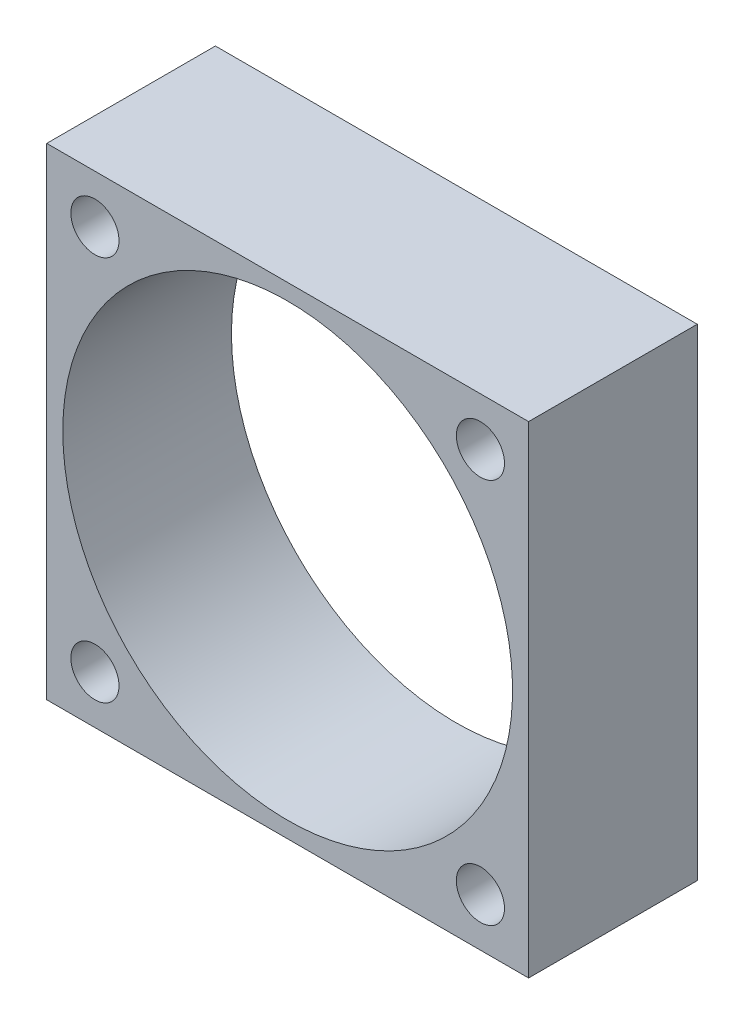
ISO-10303-21;
HEADER;
FILE_DESCRIPTION(('STEP AP214'),'2;1');
FILE_NAME('part.step','',(''),(''),'','','');
FILE_SCHEMA(('AUTOMOTIVE_DESIGN { 1 0 10303 214 1 1 1 1 }'));
ENDSEC;
DATA;
#1=APPLICATION_CONTEXT('core data for automotive mechanical design processes');
#2=APPLICATION_PROTOCOL_DEFINITION('international standard','automotive_design',2000,#1);
#3=PRODUCT_CONTEXT('',#1,'mechanical');
#4=PRODUCT('Part','Part','',(#3));
#5=PRODUCT_RELATED_PRODUCT_CATEGORY('part','',(#4));
#6=PRODUCT_DEFINITION_FORMATION('','',#4);
#7=PRODUCT_DEFINITION_CONTEXT('part definition',#1,'design');
#8=PRODUCT_DEFINITION('design','',#6,#7);
#9=PRODUCT_DEFINITION_SHAPE('','',#8);
#10=(LENGTH_UNIT() NAMED_UNIT(*) SI_UNIT(.MILLI.,.METRE.));
#11=(NAMED_UNIT(*) PLANE_ANGLE_UNIT() SI_UNIT($,.RADIAN.));
#12=(NAMED_UNIT(*) SI_UNIT($,.STERADIAN.) SOLID_ANGLE_UNIT());
#13=UNCERTAINTY_MEASURE_WITH_UNIT(LENGTH_MEASURE(1.E-05),#10,'distance_accuracy_value','');
#14=(GEOMETRIC_REPRESENTATION_CONTEXT(3) GLOBAL_UNCERTAINTY_ASSIGNED_CONTEXT((#13)) GLOBAL_UNIT_ASSIGNED_CONTEXT((#10,
#11,#12)) REPRESENTATION_CONTEXT('',''));
#15=CARTESIAN_POINT('',(0.,0.,0.));
#16=DIRECTION('',(0.,0.,1.));
#17=DIRECTION('',(1.,0.,0.));
#18=AXIS2_PLACEMENT_3D('',#15,#16,#17);
#19=CARTESIAN_POINT('',(0.,0.,10.5));
#20=DIRECTION('',(0.,0.,-1.));
#21=DIRECTION('',(-1.,0.,0.));
#22=AXIS2_PLACEMENT_3D('',#19,#20,#21);
#23=PLANE('',#22);
#24=DIRECTION('',(0.,1.,0.));
#25=VECTOR('',#24,1.);
#26=CARTESIAN_POINT('',(15.,-15.,10.5));
#27=LINE('',#26,#25);
#28=CARTESIAN_POINT('',(15.,-15.,10.5));
#29=VERTEX_POINT('',#28);
#30=CARTESIAN_POINT('',(15.,15.,10.5));
#31=VERTEX_POINT('',#30);
#32=EDGE_CURVE('E96',#29,#31,#27,.T.);
#33=ORIENTED_EDGE('',*,*,#32,.T.);
#34=DIRECTION('',(-1.,0.,0.));
#35=VECTOR('',#34,1.);
#36=CARTESIAN_POINT('',(-15.,15.,10.5));
#37=LINE('',#36,#35);
#38=CARTESIAN_POINT('',(-15.,15.,10.5));
#39=VERTEX_POINT('',#38);
#40=EDGE_CURVE('E91',#31,#39,#37,.T.);
#41=ORIENTED_EDGE('',*,*,#40,.T.);
#42=DIRECTION('',(0.,-1.,0.));
#43=VECTOR('',#42,1.);
#44=CARTESIAN_POINT('',(-15.,-15.,10.5));
#45=LINE('',#44,#43);
#46=CARTESIAN_POINT('',(-15.,-15.,10.5));
#47=VERTEX_POINT('',#46);
#48=EDGE_CURVE('E94',#39,#47,#45,.T.);
#49=ORIENTED_EDGE('',*,*,#48,.T.);
#50=DIRECTION('',(1.,0.,0.));
#51=VECTOR('',#50,1.);
#52=CARTESIAN_POINT('',(-15.,-15.,10.5));
#53=LINE('',#52,#51);
#54=EDGE_CURVE('E61',#47,#29,#53,.T.);
#55=ORIENTED_EDGE('',*,*,#54,.T.);
#56=EDGE_LOOP('',(#33,#41,#49,#55));
#57=FACE_BOUND('',#56,.T.);
#58=CARTESIAN_POINT('',(0.,0.,10.5));
#59=DIRECTION('',(0.,0.,1.));
#60=DIRECTION('',(1.,0.,0.));
#61=AXIS2_PLACEMENT_3D('',#58,#59,#60);
#62=CIRCLE('',#61,14.);
#63=CARTESIAN_POINT('',(-14.,0.,10.5));
#64=VERTEX_POINT('',#63);
#65=EDGE_CURVE('E116',#64,#64,#62,.T.);
#66=ORIENTED_EDGE('',*,*,#65,.F.);
#67=EDGE_LOOP('',(#66));
#68=FACE_BOUND('',#67,.T.);
#69=CARTESIAN_POINT('',(-12.,12.,10.5));
#70=DIRECTION('',(0.,0.,1.));
#71=DIRECTION('',(1.,0.,0.));
#72=AXIS2_PLACEMENT_3D('',#69,#70,#71);
#73=CIRCLE('',#72,1.5);
#74=CARTESIAN_POINT('',(-13.5,12.,10.5));
#75=VERTEX_POINT('',#74);
#76=EDGE_CURVE('E138',#75,#75,#73,.T.);
#77=ORIENTED_EDGE('',*,*,#76,.F.);
#78=EDGE_LOOP('',(#77));
#79=FACE_BOUND('',#78,.T.);
#80=CARTESIAN_POINT('',(12.,12.,10.5));
#81=DIRECTION('',(0.,0.,1.));
#82=DIRECTION('',(-1.,0.,0.));
#83=AXIS2_PLACEMENT_3D('',#80,#81,#82);
#84=CIRCLE('',#83,1.5);
#85=CARTESIAN_POINT('',(10.5,12.,10.5));
#86=VERTEX_POINT('',#85);
#87=EDGE_CURVE('E146',#86,#86,#84,.T.);
#88=ORIENTED_EDGE('',*,*,#87,.F.);
#89=EDGE_LOOP('',(#88));
#90=FACE_BOUND('',#89,.T.);
#91=CARTESIAN_POINT('',(12.,-12.,10.5));
#92=DIRECTION('',(0.,0.,1.));
#93=DIRECTION('',(1.,0.,0.));
#94=AXIS2_PLACEMENT_3D('',#91,#92,#93);
#95=CIRCLE('',#94,1.5);
#96=CARTESIAN_POINT('',(10.5,-12.,10.5));
#97=VERTEX_POINT('',#96);
#98=EDGE_CURVE('E154',#97,#97,#95,.T.);
#99=ORIENTED_EDGE('',*,*,#98,.F.);
#100=EDGE_LOOP('',(#99));
#101=FACE_BOUND('',#100,.T.);
#102=CARTESIAN_POINT('',(-12.,-12.,10.5));
#103=DIRECTION('',(0.,0.,1.));
#104=DIRECTION('',(-1.,0.,0.));
#105=AXIS2_PLACEMENT_3D('',#102,#103,#104);
#106=CIRCLE('',#105,1.5);
#107=CARTESIAN_POINT('',(-13.5,-12.,10.5));
#108=VERTEX_POINT('',#107);
#109=EDGE_CURVE('E162',#108,#108,#106,.T.);
#110=ORIENTED_EDGE('',*,*,#109,.F.);
#111=EDGE_LOOP('',(#110));
#112=FACE_BOUND('',#111,.T.);
#113=ADVANCED_FACE('F43',(#57,#68,#79,#90,#101,#112),#23,.F.);
#114=CARTESIAN_POINT('',(0.,0.,0.));
#115=DIRECTION('',(0.,0.,-1.));
#116=DIRECTION('',(-1.,0.,0.));
#117=AXIS2_PLACEMENT_3D('',#114,#115,#116);
#118=PLANE('',#117);
#119=CARTESIAN_POINT('',(12.,-12.,0.));
#120=DIRECTION('',(0.,0.,1.));
#121=DIRECTION('',(1.,0.,0.));
#122=AXIS2_PLACEMENT_3D('',#119,#120,#121);
#123=CIRCLE('',#122,1.5);
#124=CARTESIAN_POINT('',(10.5,-12.,0.));
#125=VERTEX_POINT('',#124);
#126=EDGE_CURVE('E158',#125,#125,#123,.T.);
#127=ORIENTED_EDGE('',*,*,#126,.T.);
#128=EDGE_LOOP('',(#127));
#129=FACE_BOUND('',#128,.T.);
#130=CARTESIAN_POINT('',(-12.,12.,0.));
#131=DIRECTION('',(0.,0.,1.));
#132=DIRECTION('',(1.,0.,0.));
#133=AXIS2_PLACEMENT_3D('',#130,#131,#132);
#134=CIRCLE('',#133,1.5);
#135=CARTESIAN_POINT('',(-13.5,12.,0.));
#136=VERTEX_POINT('',#135);
#137=EDGE_CURVE('E142',#136,#136,#134,.T.);
#138=ORIENTED_EDGE('',*,*,#137,.T.);
#139=EDGE_LOOP('',(#138));
#140=FACE_BOUND('',#139,.T.);
#141=DIRECTION('',(0.,1.,0.));
#142=VECTOR('',#141,1.);
#143=CARTESIAN_POINT('',(15.,-15.,0.));
#144=LINE('',#143,#142);
#145=CARTESIAN_POINT('',(15.,-15.,0.));
#146=VERTEX_POINT('',#145);
#147=CARTESIAN_POINT('',(15.,15.,0.));
#148=VERTEX_POINT('',#147);
#149=EDGE_CURVE('E112',#146,#148,#144,.T.);
#150=ORIENTED_EDGE('',*,*,#149,.F.);
#151=DIRECTION('',(1.,0.,0.));
#152=VECTOR('',#151,1.);
#153=CARTESIAN_POINT('',(-15.,-15.,0.));
#154=LINE('',#153,#152);
#155=CARTESIAN_POINT('',(-15.,-15.,0.));
#156=VERTEX_POINT('',#155);
#157=EDGE_CURVE('E84',#156,#146,#154,.T.);
#158=ORIENTED_EDGE('',*,*,#157,.F.);
#159=DIRECTION('',(0.,-1.,0.));
#160=VECTOR('',#159,1.);
#161=CARTESIAN_POINT('',(-15.,-15.,0.));
#162=LINE('',#161,#160);
#163=CARTESIAN_POINT('',(-15.,15.,0.));
#164=VERTEX_POINT('',#163);
#165=EDGE_CURVE('E78',#164,#156,#162,.T.);
#166=ORIENTED_EDGE('',*,*,#165,.F.);
#167=DIRECTION('',(-1.,0.,0.));
#168=VECTOR('',#167,1.);
#169=CARTESIAN_POINT('',(-15.,15.,0.));
#170=LINE('',#169,#168);
#171=EDGE_CURVE('E101',#148,#164,#170,.T.);
#172=ORIENTED_EDGE('',*,*,#171,.F.);
#173=EDGE_LOOP('',(#150,#158,#166,#172));
#174=FACE_BOUND('',#173,.T.);
#175=CARTESIAN_POINT('',(0.,0.,0.));
#176=DIRECTION('',(0.,0.,1.));
#177=DIRECTION('',(1.,0.,0.));
#178=AXIS2_PLACEMENT_3D('',#175,#176,#177);
#179=CIRCLE('',#178,14.);
#180=CARTESIAN_POINT('',(-14.,0.,0.));
#181=VERTEX_POINT('',#180);
#182=EDGE_CURVE('E134',#181,#181,#179,.T.);
#183=ORIENTED_EDGE('',*,*,#182,.T.);
#184=EDGE_LOOP('',(#183));
#185=FACE_BOUND('',#184,.T.);
#186=CARTESIAN_POINT('',(12.,12.,0.));
#187=DIRECTION('',(0.,0.,1.));
#188=DIRECTION('',(-1.,0.,0.));
#189=AXIS2_PLACEMENT_3D('',#186,#187,#188);
#190=CIRCLE('',#189,1.5);
#191=CARTESIAN_POINT('',(10.5,12.,0.));
#192=VERTEX_POINT('',#191);
#193=EDGE_CURVE('E150',#192,#192,#190,.T.);
#194=ORIENTED_EDGE('',*,*,#193,.T.);
#195=EDGE_LOOP('',(#194));
#196=FACE_BOUND('',#195,.T.);
#197=CARTESIAN_POINT('',(-12.,-12.,0.));
#198=DIRECTION('',(0.,0.,1.));
#199=DIRECTION('',(-1.,0.,0.));
#200=AXIS2_PLACEMENT_3D('',#197,#198,#199);
#201=CIRCLE('',#200,1.5);
#202=CARTESIAN_POINT('',(-13.5,-12.,0.));
#203=VERTEX_POINT('',#202);
#204=EDGE_CURVE('E166',#203,#203,#201,.T.);
#205=ORIENTED_EDGE('',*,*,#204,.T.);
#206=EDGE_LOOP('',(#205));
#207=FACE_BOUND('',#206,.T.);
#208=ADVANCED_FACE('F129',(#129,#140,#174,#185,#196,#207),#118,.T.);
#209=CARTESIAN_POINT('',(15.,-15.,10.5));
#210=DIRECTION('',(-1.,0.,0.));
#211=DIRECTION('',(0.,0.,1.));
#212=AXIS2_PLACEMENT_3D('',#209,#210,#211);
#213=PLANE('',#212);
#214=ORIENTED_EDGE('',*,*,#149,.T.);
#215=DIRECTION('',(0.,0.,-1.));
#216=VECTOR('',#215,1.);
#217=CARTESIAN_POINT('',(15.,15.,10.5));
#218=LINE('',#217,#216);
#219=EDGE_CURVE('E11',#31,#148,#218,.T.);
#220=ORIENTED_EDGE('',*,*,#219,.F.);
#221=ORIENTED_EDGE('',*,*,#32,.F.);
#222=DIRECTION('',(0.,0.,-1.));
#223=VECTOR('',#222,1.);
#224=CARTESIAN_POINT('',(15.,-15.,10.5));
#225=LINE('',#224,#223);
#226=EDGE_CURVE('E108',#29,#146,#225,.T.);
#227=ORIENTED_EDGE('',*,*,#226,.T.);
#228=EDGE_LOOP('',(#214,#220,#221,#227));
#229=FACE_BOUND('',#228,.T.);
#230=ADVANCED_FACE('F45',(#229),#213,.F.);
#231=CARTESIAN_POINT('',(-15.,15.,10.5));
#232=DIRECTION('',(0.,-1.,0.));
#233=DIRECTION('',(0.,0.,-1.));
#234=AXIS2_PLACEMENT_3D('',#231,#232,#233);
#235=PLANE('',#234);
#236=ORIENTED_EDGE('',*,*,#171,.T.);
#237=DIRECTION('',(0.,0.,-1.));
#238=VECTOR('',#237,1.);
#239=CARTESIAN_POINT('',(-15.,15.,10.5));
#240=LINE('',#239,#238);
#241=EDGE_CURVE('E53',#39,#164,#240,.T.);
#242=ORIENTED_EDGE('',*,*,#241,.F.);
#243=ORIENTED_EDGE('',*,*,#40,.F.);
#244=ORIENTED_EDGE('',*,*,#219,.T.);
#245=EDGE_LOOP('',(#236,#242,#243,#244));
#246=FACE_BOUND('',#245,.T.);
#247=ADVANCED_FACE('F100',(#246),#235,.F.);
#248=CARTESIAN_POINT('',(-15.,-15.,10.5));
#249=DIRECTION('',(1.,0.,0.));
#250=DIRECTION('',(0.,0.,-1.));
#251=AXIS2_PLACEMENT_3D('',#248,#249,#250);
#252=PLANE('',#251);
#253=ORIENTED_EDGE('',*,*,#165,.T.);
#254=DIRECTION('',(0.,0.,-1.));
#255=VECTOR('',#254,1.);
#256=CARTESIAN_POINT('',(-15.,-15.,10.5));
#257=LINE('',#256,#255);
#258=EDGE_CURVE('E103',#47,#156,#257,.T.);
#259=ORIENTED_EDGE('',*,*,#258,.F.);
#260=ORIENTED_EDGE('',*,*,#48,.F.);
#261=ORIENTED_EDGE('',*,*,#241,.T.);
#262=EDGE_LOOP('',(#253,#259,#260,#261));
#263=FACE_BOUND('',#262,.T.);
#264=ADVANCED_FACE('F104',(#263),#252,.F.);
#265=CARTESIAN_POINT('',(-15.,-15.,10.5));
#266=DIRECTION('',(0.,1.,0.));
#267=DIRECTION('',(0.,0.,1.));
#268=AXIS2_PLACEMENT_3D('',#265,#266,#267);
#269=PLANE('',#268);
#270=ORIENTED_EDGE('',*,*,#157,.T.);
#271=ORIENTED_EDGE('',*,*,#226,.F.);
#272=ORIENTED_EDGE('',*,*,#54,.F.);
#273=ORIENTED_EDGE('',*,*,#258,.T.);
#274=EDGE_LOOP('',(#270,#271,#272,#273));
#275=FACE_BOUND('',#274,.T.);
#276=ADVANCED_FACE('F126',(#275),#269,.F.);
#277=CARTESIAN_POINT('',(0.,0.,10.5));
#278=DIRECTION('',(0.,0.,-1.));
#279=DIRECTION('',(-1.,0.,0.));
#280=AXIS2_PLACEMENT_3D('',#277,#278,#279);
#281=CYLINDRICAL_SURFACE('',#280,14.);
#282=CARTESIAN_POINT('',(-14.,0.,10.5));
#283=CARTESIAN_POINT('',(-14.,0.,10.390625));
#284=CARTESIAN_POINT('',(-14.,0.,10.28125));
#285=CARTESIAN_POINT('',(-14.,0.,10.0625));
#286=CARTESIAN_POINT('',(-14.,0.,9.953125));
#287=CARTESIAN_POINT('',(-14.,0.,9.734375));
#288=CARTESIAN_POINT('',(-14.,0.,9.625));
#289=CARTESIAN_POINT('',(-14.,0.,9.40625));
#290=CARTESIAN_POINT('',(-14.,0.,9.296875));
#291=CARTESIAN_POINT('',(-14.,0.,9.078125));
#292=CARTESIAN_POINT('',(-14.,0.,8.96875));
#293=CARTESIAN_POINT('',(-14.,0.,8.75));
#294=CARTESIAN_POINT('',(-14.,0.,8.640625));
#295=CARTESIAN_POINT('',(-14.,0.,8.421875));
#296=CARTESIAN_POINT('',(-14.,0.,8.3125));
#297=CARTESIAN_POINT('',(-14.,0.,8.09375));
#298=CARTESIAN_POINT('',(-14.,0.,7.984375));
#299=CARTESIAN_POINT('',(-14.,0.,7.765625));
#300=CARTESIAN_POINT('',(-14.,0.,7.65625));
#301=CARTESIAN_POINT('',(-14.,0.,7.4375));
#302=CARTESIAN_POINT('',(-14.,0.,7.328125));
#303=CARTESIAN_POINT('',(-14.,0.,7.109375));
#304=CARTESIAN_POINT('',(-14.,0.,7.));
#305=CARTESIAN_POINT('',(-14.,0.,6.78125));
#306=CARTESIAN_POINT('',(-14.,0.,6.671875));
#307=CARTESIAN_POINT('',(-14.,0.,6.453125));
#308=CARTESIAN_POINT('',(-14.,0.,6.34375));
#309=CARTESIAN_POINT('',(-14.,0.,6.125));
#310=CARTESIAN_POINT('',(-14.,0.,6.015625));
#311=CARTESIAN_POINT('',(-14.,0.,5.796875));
#312=CARTESIAN_POINT('',(-14.,0.,5.6875));
#313=CARTESIAN_POINT('',(-14.,0.,5.46875));
#314=CARTESIAN_POINT('',(-14.,0.,5.359375));
#315=CARTESIAN_POINT('',(-14.,0.,5.140625));
#316=CARTESIAN_POINT('',(-14.,0.,5.03125));
#317=CARTESIAN_POINT('',(-14.,0.,4.8125));
#318=CARTESIAN_POINT('',(-14.,0.,4.703125));
#319=CARTESIAN_POINT('',(-14.,0.,4.484375));
#320=CARTESIAN_POINT('',(-14.,0.,4.375));
#321=CARTESIAN_POINT('',(-14.,0.,4.15625));
#322=CARTESIAN_POINT('',(-14.,0.,4.046875));
#323=CARTESIAN_POINT('',(-14.,0.,3.828125));
#324=CARTESIAN_POINT('',(-14.,0.,3.71875));
#325=CARTESIAN_POINT('',(-14.,0.,3.5));
#326=CARTESIAN_POINT('',(-14.,0.,3.390625));
#327=CARTESIAN_POINT('',(-14.,0.,3.171875));
#328=CARTESIAN_POINT('',(-14.,0.,3.0625));
#329=CARTESIAN_POINT('',(-14.,0.,2.84375));
#330=CARTESIAN_POINT('',(-14.,0.,2.734375));
#331=CARTESIAN_POINT('',(-14.,0.,2.515625));
#332=CARTESIAN_POINT('',(-14.,0.,2.40625));
#333=CARTESIAN_POINT('',(-14.,0.,2.1875));
#334=CARTESIAN_POINT('',(-14.,0.,2.078125));
#335=CARTESIAN_POINT('',(-14.,0.,1.859375));
#336=CARTESIAN_POINT('',(-14.,0.,1.75));
#337=CARTESIAN_POINT('',(-14.,0.,1.53125));
#338=CARTESIAN_POINT('',(-14.,0.,1.421875));
#339=CARTESIAN_POINT('',(-14.,0.,1.203125));
#340=CARTESIAN_POINT('',(-14.,0.,1.09375));
#341=CARTESIAN_POINT('',(-14.,0.,0.875000000000001));
#342=CARTESIAN_POINT('',(-14.,0.,0.765625000000001));
#343=CARTESIAN_POINT('',(-14.,0.,0.546875));
#344=CARTESIAN_POINT('',(-14.,0.,0.4375));
#345=CARTESIAN_POINT('',(-14.,0.,0.21875));
#346=CARTESIAN_POINT('',(-14.,0.,0.109375));
#347=CARTESIAN_POINT('',(-14.,0.,0.));
#348=B_SPLINE_CURVE_WITH_KNOTS('',3,(#282,#283,#284,#285,#286,#287,#288,#289,#290,#291,#292,
#293,#294,#295,#296,#297,#298,#299,#300,#301,#302,#303,#304,#305,#306,#307,#308,#309,#310,#311,
#312,#313,#314,#315,#316,#317,#318,#319,#320,#321,#322,#323,#324,#325,#326,#327,#328,#329,#330,
#331,#332,#333,#334,#335,#336,#337,#338,#339,#340,#341,#342,#343,#344,#345,#346,#347),
.UNSPECIFIED.,.F.,.F.,(4,2,2,2,2,2,2,2,2,2,2,2,2,2,2,2,2,2,2,2,2,2,2,2,2,2,2,2,2,2,2,2,4),(0.,
0.328125,0.656250000000001,0.984375000000001,1.3125,1.640625,1.96875,2.296875,2.625,2.953125,
3.28125,3.609375,3.9375,4.265625,4.59375,4.921875,5.25,5.578125,5.90625,6.234375,6.5625,
6.890625,7.21875,7.546875,7.875,8.203125,8.53125,8.859375,9.1875,9.515625,9.84375,10.171875,
10.5),.UNSPECIFIED.);
#349=EDGE_CURVE('BSEAM185',#64,#181,#348,.T.);
#350=ORIENTED_EDGE('',*,*,#65,.T.);
#351=ORIENTED_EDGE('',*,*,#182,.F.);
#352=ORIENTED_EDGE('',*,*,#349,.T.);
#353=ORIENTED_EDGE('',*,*,#349,.F.);
#354=EDGE_LOOP('',(#350,#352,#351,#353));
#355=FACE_BOUND('',#354,.T.);
#356=ADVANCED_FACE('F185',(#355),#281,.F.);
#357=CARTESIAN_POINT('',(-12.,12.,10.5));
#358=DIRECTION('',(0.,0.,-1.));
#359=DIRECTION('',(-1.,0.,0.));
#360=AXIS2_PLACEMENT_3D('',#357,#358,#359);
#361=CYLINDRICAL_SURFACE('',#360,1.5);
#362=CARTESIAN_POINT('',(-13.5,12.,10.5));
#363=CARTESIAN_POINT('',(-13.5,12.,10.390625));
#364=CARTESIAN_POINT('',(-13.5,12.,10.28125));
#365=CARTESIAN_POINT('',(-13.5,12.,10.0625));
#366=CARTESIAN_POINT('',(-13.5,12.,9.953125));
#367=CARTESIAN_POINT('',(-13.5,12.,9.734375));
#368=CARTESIAN_POINT('',(-13.5,12.,9.625));
#369=CARTESIAN_POINT('',(-13.5,12.,9.40625));
#370=CARTESIAN_POINT('',(-13.5,12.,9.296875));
#371=CARTESIAN_POINT('',(-13.5,12.,9.078125));
#372=CARTESIAN_POINT('',(-13.5,12.,8.96875));
#373=CARTESIAN_POINT('',(-13.5,12.,8.75));
#374=CARTESIAN_POINT('',(-13.5,12.,8.640625));
#375=CARTESIAN_POINT('',(-13.5,12.,8.421875));
#376=CARTESIAN_POINT('',(-13.5,12.,8.3125));
#377=CARTESIAN_POINT('',(-13.5,12.,8.09375));
#378=CARTESIAN_POINT('',(-13.5,12.,7.984375));
#379=CARTESIAN_POINT('',(-13.5,12.,7.765625));
#380=CARTESIAN_POINT('',(-13.5,12.,7.65625));
#381=CARTESIAN_POINT('',(-13.5,12.,7.4375));
#382=CARTESIAN_POINT('',(-13.5,12.,7.328125));
#383=CARTESIAN_POINT('',(-13.5,12.,7.109375));
#384=CARTESIAN_POINT('',(-13.5,12.,7.));
#385=CARTESIAN_POINT('',(-13.5,12.,6.78125));
#386=CARTESIAN_POINT('',(-13.5,12.,6.671875));
#387=CARTESIAN_POINT('',(-13.5,12.,6.453125));
#388=CARTESIAN_POINT('',(-13.5,12.,6.34375));
#389=CARTESIAN_POINT('',(-13.5,12.,6.125));
#390=CARTESIAN_POINT('',(-13.5,12.,6.015625));
#391=CARTESIAN_POINT('',(-13.5,12.,5.796875));
#392=CARTESIAN_POINT('',(-13.5,12.,5.6875));
#393=CARTESIAN_POINT('',(-13.5,12.,5.46875));
#394=CARTESIAN_POINT('',(-13.5,12.,5.359375));
#395=CARTESIAN_POINT('',(-13.5,12.,5.140625));
#396=CARTESIAN_POINT('',(-13.5,12.,5.03125));
#397=CARTESIAN_POINT('',(-13.5,12.,4.8125));
#398=CARTESIAN_POINT('',(-13.5,12.,4.703125));
#399=CARTESIAN_POINT('',(-13.5,12.,4.484375));
#400=CARTESIAN_POINT('',(-13.5,12.,4.375));
#401=CARTESIAN_POINT('',(-13.5,12.,4.15625));
#402=CARTESIAN_POINT('',(-13.5,12.,4.046875));
#403=CARTESIAN_POINT('',(-13.5,12.,3.828125));
#404=CARTESIAN_POINT('',(-13.5,12.,3.71875));
#405=CARTESIAN_POINT('',(-13.5,12.,3.5));
#406=CARTESIAN_POINT('',(-13.5,12.,3.390625));
#407=CARTESIAN_POINT('',(-13.5,12.,3.171875));
#408=CARTESIAN_POINT('',(-13.5,12.,3.0625));
#409=CARTESIAN_POINT('',(-13.5,12.,2.84375));
#410=CARTESIAN_POINT('',(-13.5,12.,2.734375));
#411=CARTESIAN_POINT('',(-13.5,12.,2.515625));
#412=CARTESIAN_POINT('',(-13.5,12.,2.40625));
#413=CARTESIAN_POINT('',(-13.5,12.,2.1875));
#414=CARTESIAN_POINT('',(-13.5,12.,2.078125));
#415=CARTESIAN_POINT('',(-13.5,12.,1.859375));
#416=CARTESIAN_POINT('',(-13.5,12.,1.75));
#417=CARTESIAN_POINT('',(-13.5,12.,1.53125));
#418=CARTESIAN_POINT('',(-13.5,12.,1.421875));
#419=CARTESIAN_POINT('',(-13.5,12.,1.203125));
#420=CARTESIAN_POINT('',(-13.5,12.,1.09375));
#421=CARTESIAN_POINT('',(-13.5,12.,0.875000000000001));
#422=CARTESIAN_POINT('',(-13.5,12.,0.765625000000001));
#423=CARTESIAN_POINT('',(-13.5,12.,0.546875));
#424=CARTESIAN_POINT('',(-13.5,12.,0.4375));
#425=CARTESIAN_POINT('',(-13.5,12.,0.21875));
#426=CARTESIAN_POINT('',(-13.5,12.,0.109375));
#427=CARTESIAN_POINT('',(-13.5,12.,0.));
#428=B_SPLINE_CURVE_WITH_KNOTS('',3,(#362,#363,#364,#365,#366,#367,#368,#369,#370,#371,#372,
#373,#374,#375,#376,#377,#378,#379,#380,#381,#382,#383,#384,#385,#386,#387,#388,#389,#390,#391,
#392,#393,#394,#395,#396,#397,#398,#399,#400,#401,#402,#403,#404,#405,#406,#407,#408,#409,#410,
#411,#412,#413,#414,#415,#416,#417,#418,#419,#420,#421,#422,#423,#424,#425,#426,#427),
.UNSPECIFIED.,.F.,.F.,(4,2,2,2,2,2,2,2,2,2,2,2,2,2,2,2,2,2,2,2,2,2,2,2,2,2,2,2,2,2,2,2,4),(0.,
0.328124999999999,0.656249999999999,0.984374999999999,1.3125,1.640625,1.96875,2.296875,2.625,
2.953125,3.28125,3.609375,3.9375,4.265625,4.59375,4.921875,5.25,5.578125,5.90625,6.234375,
6.5625,6.890625,7.21875,7.546875,7.875,8.203125,8.53125,8.859375,9.1875,9.515625,9.84375,
10.171875,10.5),.UNSPECIFIED.);
#429=EDGE_CURVE('BSEAM239',#75,#136,#428,.T.);
#430=ORIENTED_EDGE('',*,*,#76,.T.);
#431=ORIENTED_EDGE('',*,*,#137,.F.);
#432=ORIENTED_EDGE('',*,*,#429,.T.);
#433=ORIENTED_EDGE('',*,*,#429,.F.);
#434=EDGE_LOOP('',(#430,#432,#431,#433));
#435=FACE_BOUND('',#434,.T.);
#436=ADVANCED_FACE('F239',(#435),#361,.F.);
#437=CARTESIAN_POINT('',(12.,12.,10.5));
#438=DIRECTION('',(0.,0.,-1.));
#439=DIRECTION('',(-1.,0.,0.));
#440=AXIS2_PLACEMENT_3D('',#437,#438,#439);
#441=CYLINDRICAL_SURFACE('',#440,1.5);
#442=CARTESIAN_POINT('',(10.5,12.,10.5));
#443=CARTESIAN_POINT('',(10.5,12.,10.390625));
#444=CARTESIAN_POINT('',(10.5,12.,10.28125));
#445=CARTESIAN_POINT('',(10.5,12.,10.0625));
#446=CARTESIAN_POINT('',(10.5,12.,9.953125));
#447=CARTESIAN_POINT('',(10.5,12.,9.734375));
#448=CARTESIAN_POINT('',(10.5,12.,9.625));
#449=CARTESIAN_POINT('',(10.5,12.,9.40625));
#450=CARTESIAN_POINT('',(10.5,12.,9.296875));
#451=CARTESIAN_POINT('',(10.5,12.,9.078125));
#452=CARTESIAN_POINT('',(10.5,12.,8.96875));
#453=CARTESIAN_POINT('',(10.5,12.,8.75));
#454=CARTESIAN_POINT('',(10.5,12.,8.640625));
#455=CARTESIAN_POINT('',(10.5,12.,8.421875));
#456=CARTESIAN_POINT('',(10.5,12.,8.3125));
#457=CARTESIAN_POINT('',(10.5,12.,8.09375));
#458=CARTESIAN_POINT('',(10.5,12.,7.984375));
#459=CARTESIAN_POINT('',(10.5,12.,7.765625));
#460=CARTESIAN_POINT('',(10.5,12.,7.65625));
#461=CARTESIAN_POINT('',(10.5,12.,7.4375));
#462=CARTESIAN_POINT('',(10.5,12.,7.328125));
#463=CARTESIAN_POINT('',(10.5,12.,7.109375));
#464=CARTESIAN_POINT('',(10.5,12.,7.));
#465=CARTESIAN_POINT('',(10.5,12.,6.78125));
#466=CARTESIAN_POINT('',(10.5,12.,6.671875));
#467=CARTESIAN_POINT('',(10.5,12.,6.453125));
#468=CARTESIAN_POINT('',(10.5,12.,6.34375));
#469=CARTESIAN_POINT('',(10.5,12.,6.125));
#470=CARTESIAN_POINT('',(10.5,12.,6.015625));
#471=CARTESIAN_POINT('',(10.5,12.,5.796875));
#472=CARTESIAN_POINT('',(10.5,12.,5.6875));
#473=CARTESIAN_POINT('',(10.5,12.,5.46875));
#474=CARTESIAN_POINT('',(10.5,12.,5.359375));
#475=CARTESIAN_POINT('',(10.5,12.,5.140625));
#476=CARTESIAN_POINT('',(10.5,12.,5.03125));
#477=CARTESIAN_POINT('',(10.5,12.,4.8125));
#478=CARTESIAN_POINT('',(10.5,12.,4.703125));
#479=CARTESIAN_POINT('',(10.5,12.,4.484375));
#480=CARTESIAN_POINT('',(10.5,12.,4.375));
#481=CARTESIAN_POINT('',(10.5,12.,4.15625));
#482=CARTESIAN_POINT('',(10.5,12.,4.046875));
#483=CARTESIAN_POINT('',(10.5,12.,3.828125));
#484=CARTESIAN_POINT('',(10.5,12.,3.71875));
#485=CARTESIAN_POINT('',(10.5,12.,3.5));
#486=CARTESIAN_POINT('',(10.5,12.,3.390625));
#487=CARTESIAN_POINT('',(10.5,12.,3.171875));
#488=CARTESIAN_POINT('',(10.5,12.,3.0625));
#489=CARTESIAN_POINT('',(10.5,12.,2.84375));
#490=CARTESIAN_POINT('',(10.5,12.,2.734375));
#491=CARTESIAN_POINT('',(10.5,12.,2.515625));
#492=CARTESIAN_POINT('',(10.5,12.,2.40625));
#493=CARTESIAN_POINT('',(10.5,12.,2.1875));
#494=CARTESIAN_POINT('',(10.5,12.,2.078125));
#495=CARTESIAN_POINT('',(10.5,12.,1.859375));
#496=CARTESIAN_POINT('',(10.5,12.,1.75));
#497=CARTESIAN_POINT('',(10.5,12.,1.53125));
#498=CARTESIAN_POINT('',(10.5,12.,1.421875));
#499=CARTESIAN_POINT('',(10.5,12.,1.203125));
#500=CARTESIAN_POINT('',(10.5,12.,1.09375));
#501=CARTESIAN_POINT('',(10.5,12.,0.875000000000001));
#502=CARTESIAN_POINT('',(10.5,12.,0.765625000000001));
#503=CARTESIAN_POINT('',(10.5,12.,0.546875));
#504=CARTESIAN_POINT('',(10.5,12.,0.4375));
#505=CARTESIAN_POINT('',(10.5,12.,0.21875));
#506=CARTESIAN_POINT('',(10.5,12.,0.109375));
#507=CARTESIAN_POINT('',(10.5,12.,0.));
#508=B_SPLINE_CURVE_WITH_KNOTS('',3,(#442,#443,#444,#445,#446,#447,#448,#449,#450,#451,#452,
#453,#454,#455,#456,#457,#458,#459,#460,#461,#462,#463,#464,#465,#466,#467,#468,#469,#470,#471,
#472,#473,#474,#475,#476,#477,#478,#479,#480,#481,#482,#483,#484,#485,#486,#487,#488,#489,#490,
#491,#492,#493,#494,#495,#496,#497,#498,#499,#500,#501,#502,#503,#504,#505,#506,#507),
.UNSPECIFIED.,.F.,.F.,(4,2,2,2,2,2,2,2,2,2,2,2,2,2,2,2,2,2,2,2,2,2,2,2,2,2,2,2,2,2,2,2,4),(0.,
0.328124999999999,0.656249999999999,0.984374999999999,1.3125,1.640625,1.96875,2.296875,2.625,
2.953125,3.28125,3.609375,3.9375,4.265625,4.59375,4.921875,5.25,5.578125,5.90625,6.234375,
6.5625,6.890625,7.21875,7.546875,7.875,8.203125,8.53125,8.859375,9.1875,9.515625,9.84375,
10.171875,10.5),.UNSPECIFIED.);
#509=EDGE_CURVE('BSEAM248',#86,#192,#508,.T.);
#510=ORIENTED_EDGE('',*,*,#87,.T.);
#511=ORIENTED_EDGE('',*,*,#193,.F.);
#512=ORIENTED_EDGE('',*,*,#509,.T.);
#513=ORIENTED_EDGE('',*,*,#509,.F.);
#514=EDGE_LOOP('',(#510,#512,#511,#513));
#515=FACE_BOUND('',#514,.T.);
#516=ADVANCED_FACE('F248',(#515),#441,.F.);
#517=CARTESIAN_POINT('',(12.,-12.,10.5));
#518=DIRECTION('',(0.,0.,-1.));
#519=DIRECTION('',(-1.,0.,0.));
#520=AXIS2_PLACEMENT_3D('',#517,#518,#519);
#521=CYLINDRICAL_SURFACE('',#520,1.5);
#522=CARTESIAN_POINT('',(10.5,-12.,10.5));
#523=CARTESIAN_POINT('',(10.5,-12.,10.390625));
#524=CARTESIAN_POINT('',(10.5,-12.,10.28125));
#525=CARTESIAN_POINT('',(10.5,-12.,10.0625));
#526=CARTESIAN_POINT('',(10.5,-12.,9.953125));
#527=CARTESIAN_POINT('',(10.5,-12.,9.734375));
#528=CARTESIAN_POINT('',(10.5,-12.,9.625));
#529=CARTESIAN_POINT('',(10.5,-12.,9.40625));
#530=CARTESIAN_POINT('',(10.5,-12.,9.296875));
#531=CARTESIAN_POINT('',(10.5,-12.,9.078125));
#532=CARTESIAN_POINT('',(10.5,-12.,8.96875));
#533=CARTESIAN_POINT('',(10.5,-12.,8.75));
#534=CARTESIAN_POINT('',(10.5,-12.,8.640625));
#535=CARTESIAN_POINT('',(10.5,-12.,8.421875));
#536=CARTESIAN_POINT('',(10.5,-12.,8.3125));
#537=CARTESIAN_POINT('',(10.5,-12.,8.09375));
#538=CARTESIAN_POINT('',(10.5,-12.,7.984375));
#539=CARTESIAN_POINT('',(10.5,-12.,7.765625));
#540=CARTESIAN_POINT('',(10.5,-12.,7.65625));
#541=CARTESIAN_POINT('',(10.5,-12.,7.4375));
#542=CARTESIAN_POINT('',(10.5,-12.,7.328125));
#543=CARTESIAN_POINT('',(10.5,-12.,7.109375));
#544=CARTESIAN_POINT('',(10.5,-12.,7.));
#545=CARTESIAN_POINT('',(10.5,-12.,6.78125));
#546=CARTESIAN_POINT('',(10.5,-12.,6.671875));
#547=CARTESIAN_POINT('',(10.5,-12.,6.453125));
#548=CARTESIAN_POINT('',(10.5,-12.,6.34375));
#549=CARTESIAN_POINT('',(10.5,-12.,6.125));
#550=CARTESIAN_POINT('',(10.5,-12.,6.015625));
#551=CARTESIAN_POINT('',(10.5,-12.,5.796875));
#552=CARTESIAN_POINT('',(10.5,-12.,5.6875));
#553=CARTESIAN_POINT('',(10.5,-12.,5.46875));
#554=CARTESIAN_POINT('',(10.5,-12.,5.359375));
#555=CARTESIAN_POINT('',(10.5,-12.,5.140625));
#556=CARTESIAN_POINT('',(10.5,-12.,5.03125));
#557=CARTESIAN_POINT('',(10.5,-12.,4.8125));
#558=CARTESIAN_POINT('',(10.5,-12.,4.703125));
#559=CARTESIAN_POINT('',(10.5,-12.,4.484375));
#560=CARTESIAN_POINT('',(10.5,-12.,4.375));
#561=CARTESIAN_POINT('',(10.5,-12.,4.15625));
#562=CARTESIAN_POINT('',(10.5,-12.,4.046875));
#563=CARTESIAN_POINT('',(10.5,-12.,3.828125));
#564=CARTESIAN_POINT('',(10.5,-12.,3.71875));
#565=CARTESIAN_POINT('',(10.5,-12.,3.5));
#566=CARTESIAN_POINT('',(10.5,-12.,3.390625));
#567=CARTESIAN_POINT('',(10.5,-12.,3.171875));
#568=CARTESIAN_POINT('',(10.5,-12.,3.0625));
#569=CARTESIAN_POINT('',(10.5,-12.,2.84375));
#570=CARTESIAN_POINT('',(10.5,-12.,2.734375));
#571=CARTESIAN_POINT('',(10.5,-12.,2.515625));
#572=CARTESIAN_POINT('',(10.5,-12.,2.40625));
#573=CARTESIAN_POINT('',(10.5,-12.,2.1875));
#574=CARTESIAN_POINT('',(10.5,-12.,2.078125));
#575=CARTESIAN_POINT('',(10.5,-12.,1.859375));
#576=CARTESIAN_POINT('',(10.5,-12.,1.75));
#577=CARTESIAN_POINT('',(10.5,-12.,1.53125));
#578=CARTESIAN_POINT('',(10.5,-12.,1.421875));
#579=CARTESIAN_POINT('',(10.5,-12.,1.203125));
#580=CARTESIAN_POINT('',(10.5,-12.,1.09375));
#581=CARTESIAN_POINT('',(10.5,-12.,0.875000000000001));
#582=CARTESIAN_POINT('',(10.5,-12.,0.765625000000001));
#583=CARTESIAN_POINT('',(10.5,-12.,0.546875));
#584=CARTESIAN_POINT('',(10.5,-12.,0.4375));
#585=CARTESIAN_POINT('',(10.5,-12.,0.21875));
#586=CARTESIAN_POINT('',(10.5,-12.,0.109375));
#587=CARTESIAN_POINT('',(10.5,-12.,0.));
#588=B_SPLINE_CURVE_WITH_KNOTS('',3,(#522,#523,#524,#525,#526,#527,#528,#529,#530,#531,#532,
#533,#534,#535,#536,#537,#538,#539,#540,#541,#542,#543,#544,#545,#546,#547,#548,#549,#550,#551,
#552,#553,#554,#555,#556,#557,#558,#559,#560,#561,#562,#563,#564,#565,#566,#567,#568,#569,#570,
#571,#572,#573,#574,#575,#576,#577,#578,#579,#580,#581,#582,#583,#584,#585,#586,#587),
.UNSPECIFIED.,.F.,.F.,(4,2,2,2,2,2,2,2,2,2,2,2,2,2,2,2,2,2,2,2,2,2,2,2,2,2,2,2,2,2,2,2,4),(0.,
0.328124999999999,0.656249999999999,0.984374999999999,1.3125,1.640625,1.96875,2.296875,2.625,
2.953125,3.28125,3.609375,3.9375,4.265625,4.59375,4.921875,5.25,5.578125,5.90625,6.234375,
6.5625,6.890625,7.21875,7.546875,7.875,8.203125,8.53125,8.859375,9.1875,9.515625,9.84375,
10.171875,10.5),.UNSPECIFIED.);
#589=EDGE_CURVE('BSEAM257',#97,#125,#588,.T.);
#590=ORIENTED_EDGE('',*,*,#98,.T.);
#591=ORIENTED_EDGE('',*,*,#126,.F.);
#592=ORIENTED_EDGE('',*,*,#589,.T.);
#593=ORIENTED_EDGE('',*,*,#589,.F.);
#594=EDGE_LOOP('',(#590,#592,#591,#593));
#595=FACE_BOUND('',#594,.T.);
#596=ADVANCED_FACE('F257',(#595),#521,.F.);
#597=CARTESIAN_POINT('',(-12.,-12.,10.5));
#598=DIRECTION('',(0.,0.,-1.));
#599=DIRECTION('',(-1.,0.,0.));
#600=AXIS2_PLACEMENT_3D('',#597,#598,#599);
#601=CYLINDRICAL_SURFACE('',#600,1.5);
#602=CARTESIAN_POINT('',(-13.5,-12.,10.5));
#603=CARTESIAN_POINT('',(-13.5,-12.,10.390625));
#604=CARTESIAN_POINT('',(-13.5,-12.,10.28125));
#605=CARTESIAN_POINT('',(-13.5,-12.,10.0625));
#606=CARTESIAN_POINT('',(-13.5,-12.,9.953125));
#607=CARTESIAN_POINT('',(-13.5,-12.,9.734375));
#608=CARTESIAN_POINT('',(-13.5,-12.,9.625));
#609=CARTESIAN_POINT('',(-13.5,-12.,9.40625));
#610=CARTESIAN_POINT('',(-13.5,-12.,9.296875));
#611=CARTESIAN_POINT('',(-13.5,-12.,9.078125));
#612=CARTESIAN_POINT('',(-13.5,-12.,8.96875));
#613=CARTESIAN_POINT('',(-13.5,-12.,8.75));
#614=CARTESIAN_POINT('',(-13.5,-12.,8.640625));
#615=CARTESIAN_POINT('',(-13.5,-12.,8.421875));
#616=CARTESIAN_POINT('',(-13.5,-12.,8.3125));
#617=CARTESIAN_POINT('',(-13.5,-12.,8.09375));
#618=CARTESIAN_POINT('',(-13.5,-12.,7.984375));
#619=CARTESIAN_POINT('',(-13.5,-12.,7.765625));
#620=CARTESIAN_POINT('',(-13.5,-12.,7.65625));
#621=CARTESIAN_POINT('',(-13.5,-12.,7.4375));
#622=CARTESIAN_POINT('',(-13.5,-12.,7.328125));
#623=CARTESIAN_POINT('',(-13.5,-12.,7.109375));
#624=CARTESIAN_POINT('',(-13.5,-12.,7.));
#625=CARTESIAN_POINT('',(-13.5,-12.,6.78125));
#626=CARTESIAN_POINT('',(-13.5,-12.,6.671875));
#627=CARTESIAN_POINT('',(-13.5,-12.,6.453125));
#628=CARTESIAN_POINT('',(-13.5,-12.,6.34375));
#629=CARTESIAN_POINT('',(-13.5,-12.,6.125));
#630=CARTESIAN_POINT('',(-13.5,-12.,6.015625));
#631=CARTESIAN_POINT('',(-13.5,-12.,5.796875));
#632=CARTESIAN_POINT('',(-13.5,-12.,5.6875));
#633=CARTESIAN_POINT('',(-13.5,-12.,5.46875));
#634=CARTESIAN_POINT('',(-13.5,-12.,5.359375));
#635=CARTESIAN_POINT('',(-13.5,-12.,5.140625));
#636=CARTESIAN_POINT('',(-13.5,-12.,5.03125));
#637=CARTESIAN_POINT('',(-13.5,-12.,4.8125));
#638=CARTESIAN_POINT('',(-13.5,-12.,4.703125));
#639=CARTESIAN_POINT('',(-13.5,-12.,4.484375));
#640=CARTESIAN_POINT('',(-13.5,-12.,4.375));
#641=CARTESIAN_POINT('',(-13.5,-12.,4.15625));
#642=CARTESIAN_POINT('',(-13.5,-12.,4.046875));
#643=CARTESIAN_POINT('',(-13.5,-12.,3.828125));
#644=CARTESIAN_POINT('',(-13.5,-12.,3.71875));
#645=CARTESIAN_POINT('',(-13.5,-12.,3.5));
#646=CARTESIAN_POINT('',(-13.5,-12.,3.390625));
#647=CARTESIAN_POINT('',(-13.5,-12.,3.171875));
#648=CARTESIAN_POINT('',(-13.5,-12.,3.0625));
#649=CARTESIAN_POINT('',(-13.5,-12.,2.84375));
#650=CARTESIAN_POINT('',(-13.5,-12.,2.734375));
#651=CARTESIAN_POINT('',(-13.5,-12.,2.515625));
#652=CARTESIAN_POINT('',(-13.5,-12.,2.40625));
#653=CARTESIAN_POINT('',(-13.5,-12.,2.1875));
#654=CARTESIAN_POINT('',(-13.5,-12.,2.078125));
#655=CARTESIAN_POINT('',(-13.5,-12.,1.859375));
#656=CARTESIAN_POINT('',(-13.5,-12.,1.75));
#657=CARTESIAN_POINT('',(-13.5,-12.,1.53125));
#658=CARTESIAN_POINT('',(-13.5,-12.,1.421875));
#659=CARTESIAN_POINT('',(-13.5,-12.,1.203125));
#660=CARTESIAN_POINT('',(-13.5,-12.,1.09375));
#661=CARTESIAN_POINT('',(-13.5,-12.,0.875000000000001));
#662=CARTESIAN_POINT('',(-13.5,-12.,0.765625000000001));
#663=CARTESIAN_POINT('',(-13.5,-12.,0.546875));
#664=CARTESIAN_POINT('',(-13.5,-12.,0.4375));
#665=CARTESIAN_POINT('',(-13.5,-12.,0.21875));
#666=CARTESIAN_POINT('',(-13.5,-12.,0.109375));
#667=CARTESIAN_POINT('',(-13.5,-12.,0.));
#668=B_SPLINE_CURVE_WITH_KNOTS('',3,(#602,#603,#604,#605,#606,#607,#608,#609,#610,#611,#612,
#613,#614,#615,#616,#617,#618,#619,#620,#621,#622,#623,#624,#625,#626,#627,#628,#629,#630,#631,
#632,#633,#634,#635,#636,#637,#638,#639,#640,#641,#642,#643,#644,#645,#646,#647,#648,#649,#650,
#651,#652,#653,#654,#655,#656,#657,#658,#659,#660,#661,#662,#663,#664,#665,#666,#667),
.UNSPECIFIED.,.F.,.F.,(4,2,2,2,2,2,2,2,2,2,2,2,2,2,2,2,2,2,2,2,2,2,2,2,2,2,2,2,2,2,2,2,4),(0.,
0.328124999999999,0.656249999999999,0.984374999999999,1.3125,1.640625,1.96875,2.296875,2.625,
2.953125,3.28125,3.609375,3.9375,4.265625,4.59375,4.921875,5.25,5.578125,5.90625,6.234375,
6.5625,6.890625,7.21875,7.546875,7.875,8.203125,8.53125,8.859375,9.1875,9.515625,9.84375,
10.171875,10.5),.UNSPECIFIED.);
#669=EDGE_CURVE('BSEAM174',#108,#203,#668,.T.);
#670=ORIENTED_EDGE('',*,*,#109,.T.);
#671=ORIENTED_EDGE('',*,*,#204,.F.);
#672=ORIENTED_EDGE('',*,*,#669,.T.);
#673=ORIENTED_EDGE('',*,*,#669,.F.);
#674=EDGE_LOOP('',(#670,#672,#671,#673));
#675=FACE_BOUND('',#674,.T.);
#676=ADVANCED_FACE('F174',(#675),#601,.F.);
#677=CLOSED_SHELL('',(#113,#208,#230,#247,#264,#276,#356,#436,#516,#596,#676));
#678=MANIFOLD_SOLID_BREP('B2',#677);
#679=ADVANCED_BREP_SHAPE_REPRESENTATION('',(#18,#678),#14);
#680=SHAPE_DEFINITION_REPRESENTATION(#9,#679);
ENDSEC;
END-ISO-10303-21;
